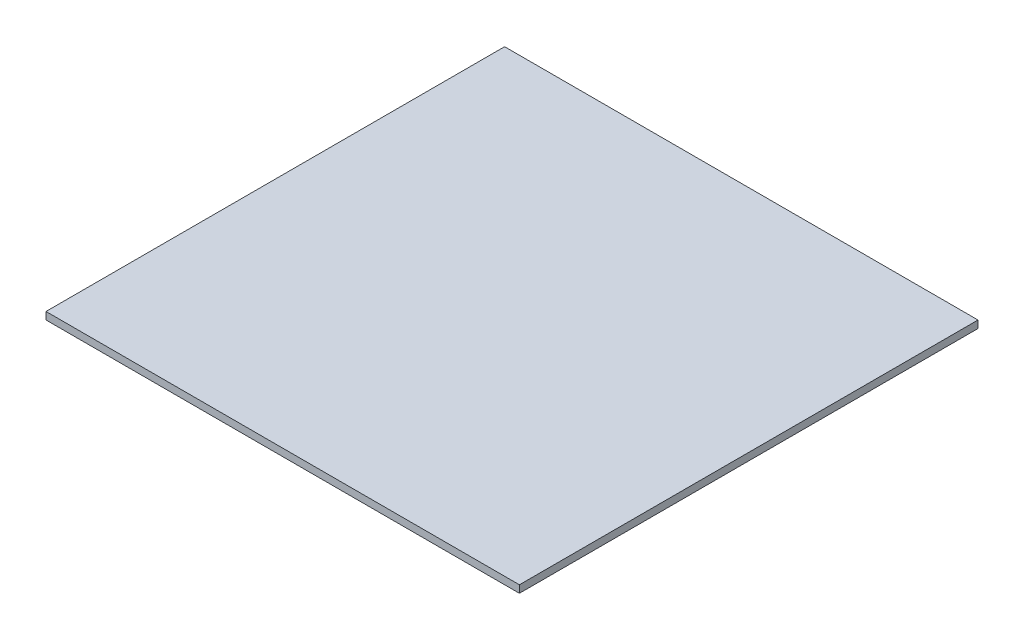
ISO-10303-21;
HEADER;
FILE_DESCRIPTION(('STEP AP214'),'2;1');
FILE_NAME('part.step','',(''),(''),'','','');
FILE_SCHEMA(('AUTOMOTIVE_DESIGN { 1 0 10303 214 1 1 1 1 }'));
ENDSEC;
DATA;
#1=APPLICATION_CONTEXT('core data for automotive mechanical design processes');
#2=APPLICATION_PROTOCOL_DEFINITION('international standard','automotive_design',2000,#1);
#3=PRODUCT_CONTEXT('',#1,'mechanical');
#4=PRODUCT('Part','Part','',(#3));
#5=PRODUCT_RELATED_PRODUCT_CATEGORY('part','',(#4));
#6=PRODUCT_DEFINITION_FORMATION('','',#4);
#7=PRODUCT_DEFINITION_CONTEXT('part definition',#1,'design');
#8=PRODUCT_DEFINITION('design','',#6,#7);
#9=PRODUCT_DEFINITION_SHAPE('','',#8);
#10=(LENGTH_UNIT() NAMED_UNIT(*) SI_UNIT(.MILLI.,.METRE.));
#11=(NAMED_UNIT(*) PLANE_ANGLE_UNIT() SI_UNIT($,.RADIAN.));
#12=(NAMED_UNIT(*) SI_UNIT($,.STERADIAN.) SOLID_ANGLE_UNIT());
#13=UNCERTAINTY_MEASURE_WITH_UNIT(LENGTH_MEASURE(1.E-05),#10,'distance_accuracy_value','');
#14=(GEOMETRIC_REPRESENTATION_CONTEXT(3) GLOBAL_UNCERTAINTY_ASSIGNED_CONTEXT((#13)) GLOBAL_UNIT_ASSIGNED_CONTEXT((#10,
#11,#12)) REPRESENTATION_CONTEXT('',''));
#15=CARTESIAN_POINT('',(0.,0.,0.));
#16=DIRECTION('',(0.,0.,1.));
#17=DIRECTION('',(1.,0.,0.));
#18=AXIS2_PLACEMENT_3D('',#15,#16,#17);
#19=CARTESIAN_POINT('',(101.6,3.175,98.425));
#20=DIRECTION('',(-1.,0.,0.));
#21=DIRECTION('',(0.,0.,1.));
#22=AXIS2_PLACEMENT_3D('',#19,#20,#21);
#23=PLANE('',#22);
#24=DIRECTION('',(0.,0.,-1.));
#25=VECTOR('',#24,1.);
#26=CARTESIAN_POINT('',(101.6,0.,98.425));
#27=LINE('',#26,#25);
#28=CARTESIAN_POINT('',(101.6,0.,98.425));
#29=VERTEX_POINT('',#28);
#30=CARTESIAN_POINT('',(101.6,0.,-98.425));
#31=VERTEX_POINT('',#30);
#32=EDGE_CURVE('E96',#29,#31,#27,.T.);
#33=ORIENTED_EDGE('',*,*,#32,.T.);
#34=DIRECTION('',(0.,-1.,0.));
#35=VECTOR('',#34,1.);
#36=CARTESIAN_POINT('',(101.6,3.175,-98.425));
#37=LINE('',#36,#35);
#38=CARTESIAN_POINT('',(101.6,3.175,-98.425));
#39=VERTEX_POINT('',#38);
#40=EDGE_CURVE('E11',#39,#31,#37,.T.);
#41=ORIENTED_EDGE('',*,*,#40,.F.);
#42=DIRECTION('',(0.,0.,-1.));
#43=VECTOR('',#42,1.);
#44=CARTESIAN_POINT('',(101.6,3.175,98.425));
#45=LINE('',#44,#43);
#46=CARTESIAN_POINT('',(101.6,3.175,98.425));
#47=VERTEX_POINT('',#46);
#48=EDGE_CURVE('E84',#47,#39,#45,.T.);
#49=ORIENTED_EDGE('',*,*,#48,.F.);
#50=DIRECTION('',(0.,-1.,0.));
#51=VECTOR('',#50,1.);
#52=CARTESIAN_POINT('',(101.6,3.175,98.425));
#53=LINE('',#52,#51);
#54=EDGE_CURVE('E92',#47,#29,#53,.T.);
#55=ORIENTED_EDGE('',*,*,#54,.T.);
#56=EDGE_LOOP('',(#33,#41,#49,#55));
#57=FACE_BOUND('',#56,.T.);
#58=ADVANCED_FACE('F33',(#57),#23,.F.);
#59=CARTESIAN_POINT('',(-101.6,3.175,-98.425));
#60=DIRECTION('',(0.,0.,1.));
#61=DIRECTION('',(1.,0.,0.));
#62=AXIS2_PLACEMENT_3D('',#59,#60,#61);
#63=PLANE('',#62);
#64=DIRECTION('',(-1.,0.,0.));
#65=VECTOR('',#64,1.);
#66=CARTESIAN_POINT('',(-101.6,0.,-98.425));
#67=LINE('',#66,#65);
#68=CARTESIAN_POINT('',(-101.6,0.,-98.425));
#69=VERTEX_POINT('',#68);
#70=EDGE_CURVE('E88',#31,#69,#67,.T.);
#71=ORIENTED_EDGE('',*,*,#70,.T.);
#72=DIRECTION('',(0.,-1.,0.));
#73=VECTOR('',#72,1.);
#74=CARTESIAN_POINT('',(-101.6,3.175,-98.425));
#75=LINE('',#74,#73);
#76=CARTESIAN_POINT('',(-101.6,3.175,-98.425));
#77=VERTEX_POINT('',#76);
#78=EDGE_CURVE('E41',#77,#69,#75,.T.);
#79=ORIENTED_EDGE('',*,*,#78,.F.);
#80=DIRECTION('',(-1.,0.,0.));
#81=VECTOR('',#80,1.);
#82=CARTESIAN_POINT('',(-101.6,3.175,-98.425));
#83=LINE('',#82,#81);
#84=EDGE_CURVE('E79',#39,#77,#83,.T.);
#85=ORIENTED_EDGE('',*,*,#84,.F.);
#86=ORIENTED_EDGE('',*,*,#40,.T.);
#87=EDGE_LOOP('',(#71,#79,#85,#86));
#88=FACE_BOUND('',#87,.T.);
#89=ADVANCED_FACE('F87',(#88),#63,.F.);
#90=CARTESIAN_POINT('',(-101.6,3.175,98.425));
#91=DIRECTION('',(1.,0.,0.));
#92=DIRECTION('',(0.,0.,-1.));
#93=AXIS2_PLACEMENT_3D('',#90,#91,#92);
#94=PLANE('',#93);
#95=DIRECTION('',(0.,0.,1.));
#96=VECTOR('',#95,1.);
#97=CARTESIAN_POINT('',(-101.6,0.,98.425));
#98=LINE('',#97,#96);
#99=CARTESIAN_POINT('',(-101.6,0.,98.425));
#100=VERTEX_POINT('',#99);
#101=EDGE_CURVE('E66',#69,#100,#98,.T.);
#102=ORIENTED_EDGE('',*,*,#101,.T.);
#103=DIRECTION('',(0.,-1.,0.));
#104=VECTOR('',#103,1.);
#105=CARTESIAN_POINT('',(-101.6,3.175,98.425));
#106=LINE('',#105,#104);
#107=CARTESIAN_POINT('',(-101.6,3.175,98.425));
#108=VERTEX_POINT('',#107);
#109=EDGE_CURVE('E89',#108,#100,#106,.T.);
#110=ORIENTED_EDGE('',*,*,#109,.F.);
#111=DIRECTION('',(0.,0.,1.));
#112=VECTOR('',#111,1.);
#113=CARTESIAN_POINT('',(-101.6,3.175,98.425));
#114=LINE('',#113,#112);
#115=EDGE_CURVE('E82',#77,#108,#114,.T.);
#116=ORIENTED_EDGE('',*,*,#115,.F.);
#117=ORIENTED_EDGE('',*,*,#78,.T.);
#118=EDGE_LOOP('',(#102,#110,#116,#117));
#119=FACE_BOUND('',#118,.T.);
#120=ADVANCED_FACE('F90',(#119),#94,.F.);
#121=CARTESIAN_POINT('',(-101.6,3.175,98.425));
#122=DIRECTION('',(0.,0.,-1.));
#123=DIRECTION('',(-1.,0.,0.));
#124=AXIS2_PLACEMENT_3D('',#121,#122,#123);
#125=PLANE('',#124);
#126=DIRECTION('',(1.,0.,0.));
#127=VECTOR('',#126,1.);
#128=CARTESIAN_POINT('',(-101.6,0.,98.425));
#129=LINE('',#128,#127);
#130=EDGE_CURVE('E72',#100,#29,#129,.T.);
#131=ORIENTED_EDGE('',*,*,#130,.T.);
#132=ORIENTED_EDGE('',*,*,#54,.F.);
#133=DIRECTION('',(1.,0.,0.));
#134=VECTOR('',#133,1.);
#135=CARTESIAN_POINT('',(-101.6,3.175,98.425));
#136=LINE('',#135,#134);
#137=EDGE_CURVE('E49',#108,#47,#136,.T.);
#138=ORIENTED_EDGE('',*,*,#137,.F.);
#139=ORIENTED_EDGE('',*,*,#109,.T.);
#140=EDGE_LOOP('',(#131,#132,#138,#139));
#141=FACE_BOUND('',#140,.T.);
#142=ADVANCED_FACE('F103',(#141),#125,.F.);
#143=CARTESIAN_POINT('',(0.,3.175,0.));
#144=DIRECTION('',(0.,-1.,0.));
#145=DIRECTION('',(0.,0.,-1.));
#146=AXIS2_PLACEMENT_3D('',#143,#144,#145);
#147=PLANE('',#146);
#148=ORIENTED_EDGE('',*,*,#48,.T.);
#149=ORIENTED_EDGE('',*,*,#84,.T.);
#150=ORIENTED_EDGE('',*,*,#115,.T.);
#151=ORIENTED_EDGE('',*,*,#137,.T.);
#152=EDGE_LOOP('',(#148,#149,#150,#151));
#153=FACE_BOUND('',#152,.T.);
#154=ADVANCED_FACE('F80',(#153),#147,.F.);
#155=CARTESIAN_POINT('',(0.,0.,0.));
#156=DIRECTION('',(0.,-1.,0.));
#157=DIRECTION('',(0.,0.,-1.));
#158=AXIS2_PLACEMENT_3D('',#155,#156,#157);
#159=PLANE('',#158);
#160=ORIENTED_EDGE('',*,*,#32,.F.);
#161=ORIENTED_EDGE('',*,*,#130,.F.);
#162=ORIENTED_EDGE('',*,*,#101,.F.);
#163=ORIENTED_EDGE('',*,*,#70,.F.);
#164=EDGE_LOOP('',(#160,#161,#162,#163));
#165=FACE_BOUND('',#164,.T.);
#166=ADVANCED_FACE('F106',(#165),#159,.T.);
#167=CLOSED_SHELL('',(#58,#89,#120,#142,#154,#166));
#168=MANIFOLD_SOLID_BREP('B2',#167);
#169=ADVANCED_BREP_SHAPE_REPRESENTATION('',(#18,#168),#14);
#170=SHAPE_DEFINITION_REPRESENTATION(#9,#169);
ENDSEC;
END-ISO-10303-21;
